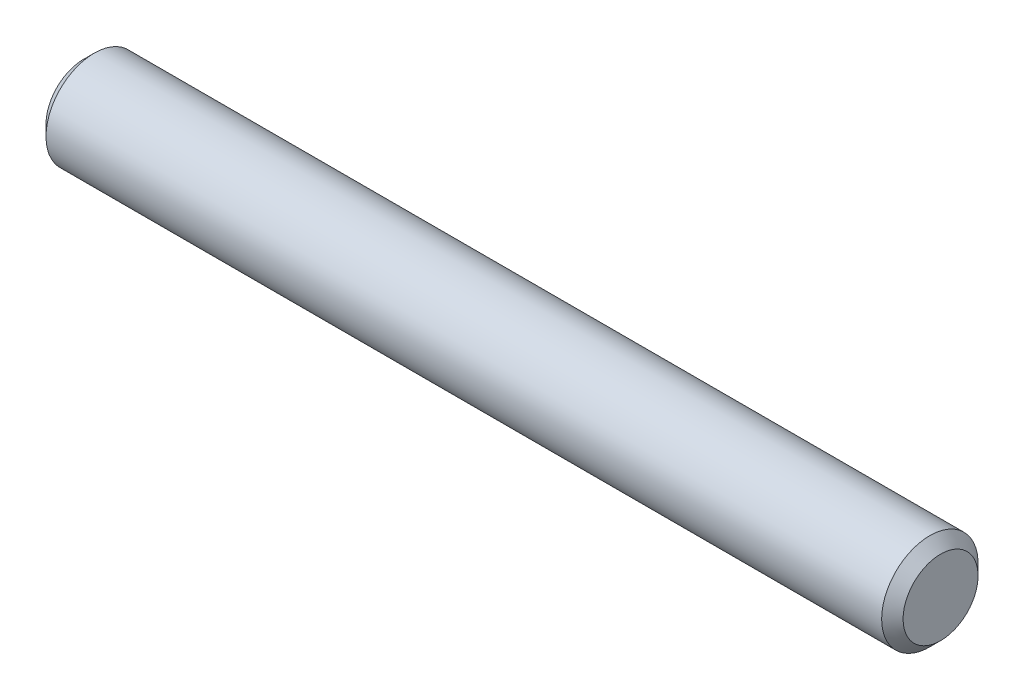
ISO-10303-21;
HEADER;
FILE_DESCRIPTION(('STEP AP214'),'2;1');
FILE_NAME('part.step','',(''),(''),'','','');
FILE_SCHEMA(('AUTOMOTIVE_DESIGN { 1 0 10303 214 1 1 1 1 }'));
ENDSEC;
DATA;
#1=APPLICATION_CONTEXT('core data for automotive mechanical design processes');
#2=APPLICATION_PROTOCOL_DEFINITION('international standard','automotive_design',2000,#1);
#3=PRODUCT_CONTEXT('',#1,'mechanical');
#4=PRODUCT('Part','Part','',(#3));
#5=PRODUCT_RELATED_PRODUCT_CATEGORY('part','',(#4));
#6=PRODUCT_DEFINITION_FORMATION('','',#4);
#7=PRODUCT_DEFINITION_CONTEXT('part definition',#1,'design');
#8=PRODUCT_DEFINITION('design','',#6,#7);
#9=PRODUCT_DEFINITION_SHAPE('','',#8);
#10=(LENGTH_UNIT() NAMED_UNIT(*) SI_UNIT(.MILLI.,.METRE.));
#11=(NAMED_UNIT(*) PLANE_ANGLE_UNIT() SI_UNIT($,.RADIAN.));
#12=(NAMED_UNIT(*) SI_UNIT($,.STERADIAN.) SOLID_ANGLE_UNIT());
#13=UNCERTAINTY_MEASURE_WITH_UNIT(LENGTH_MEASURE(1.E-05),#10,'distance_accuracy_value','');
#14=(GEOMETRIC_REPRESENTATION_CONTEXT(3) GLOBAL_UNCERTAINTY_ASSIGNED_CONTEXT((#13)) GLOBAL_UNIT_ASSIGNED_CONTEXT((#10,
#11,#12)) REPRESENTATION_CONTEXT('',''));
#15=CARTESIAN_POINT('',(0.,0.,0.));
#16=DIRECTION('',(0.,0.,1.));
#17=DIRECTION('',(1.,0.,0.));
#18=AXIS2_PLACEMENT_3D('',#15,#16,#17);
#19=CARTESIAN_POINT('',(-5.34269662921348,0.,0.));
#20=DIRECTION('',(1.,0.,0.));
#21=DIRECTION('',(0.,0.,-1.));
#22=AXIS2_PLACEMENT_3D('',#19,#20,#21);
#23=PLANE('',#22);
#24=CARTESIAN_POINT('',(-5.34269662921348,0.,0.));
#25=DIRECTION('',(1.,0.,0.));
#26=DIRECTION('',(0.,0.,-1.));
#27=AXIS2_PLACEMENT_3D('',#24,#25,#26);
#28=CIRCLE('',#27,0.699999999999999);
#29=CARTESIAN_POINT('',(-5.34269662921348,0.,-0.699999999999999));
#30=VERTEX_POINT('',#29);
#31=EDGE_CURVE('E48',#30,#30,#28,.F.);
#32=ORIENTED_EDGE('',*,*,#31,.T.);
#33=EDGE_LOOP('',(#32));
#34=FACE_BOUND('',#33,.T.);
#35=ADVANCED_FACE('F33',(#34),#23,.F.);
#36=CARTESIAN_POINT('',(-6.32022471910112,0.,0.));
#37=DIRECTION('',(-1.,0.,0.));
#38=DIRECTION('',(0.,0.,1.));
#39=AXIS2_PLACEMENT_3D('',#36,#37,#38);
#40=CYLINDRICAL_SURFACE('',#39,0.9);
#41=CARTESIAN_POINT('',(-5.14269662921348,0.,0.));
#42=DIRECTION('',(1.,0.,0.));
#43=DIRECTION('',(0.,0.,-1.));
#44=AXIS2_PLACEMENT_3D('',#41,#42,#43);
#45=CIRCLE('',#44,0.9);
#46=CARTESIAN_POINT('',(-5.14269662921348,0.,-0.9));
#47=VERTEX_POINT('',#46);
#48=EDGE_CURVE('E40',#47,#47,#45,.T.);
#49=ORIENTED_EDGE('',*,*,#48,.T.);
#50=EDGE_LOOP('',(#49));
#51=FACE_BOUND('',#50,.T.);
#52=CARTESIAN_POINT('',(10.4573033707865,0.,0.));
#53=DIRECTION('',(-1.,0.,0.));
#54=DIRECTION('',(0.,0.,1.));
#55=AXIS2_PLACEMENT_3D('',#52,#53,#54);
#56=CIRCLE('',#55,0.9);
#57=CARTESIAN_POINT('',(10.4573033707865,0.,0.9));
#58=VERTEX_POINT('',#57);
#59=EDGE_CURVE('E44',#58,#58,#56,.T.);
#60=ORIENTED_EDGE('',*,*,#59,.T.);
#61=EDGE_LOOP('',(#60));
#62=FACE_BOUND('',#61,.T.);
#63=ADVANCED_FACE('F64',(#51,#62),#40,.T.);
#64=CARTESIAN_POINT('',(10.6573033707865,0.9,0.));
#65=DIRECTION('',(-1.,0.,0.));
#66=DIRECTION('',(0.,0.,1.));
#67=AXIS2_PLACEMENT_3D('',#64,#65,#66);
#68=PLANE('',#67);
#69=CARTESIAN_POINT('',(10.6573033707865,0.,0.));
#70=DIRECTION('',(-1.,0.,0.));
#71=DIRECTION('',(0.,0.,1.));
#72=AXIS2_PLACEMENT_3D('',#69,#70,#71);
#73=CIRCLE('',#72,0.699999999999999);
#74=CARTESIAN_POINT('',(10.6573033707865,0.,0.699999999999999));
#75=VERTEX_POINT('',#74);
#76=EDGE_CURVE('E10',#75,#75,#73,.F.);
#77=ORIENTED_EDGE('',*,*,#76,.T.);
#78=EDGE_LOOP('',(#77));
#79=FACE_BOUND('',#78,.T.);
#80=ADVANCED_FACE('F57',(#79),#68,.F.);
#81=CARTESIAN_POINT('',(-5.34269662921348,0.,0.));
#82=DIRECTION('',(1.,0.,0.));
#83=DIRECTION('',(0.,0.,-1.));
#84=AXIS2_PLACEMENT_3D('',#81,#82,#83);
#85=CONICAL_SURFACE('',#84,0.699999999999999,0.785398163397449);
#86=ORIENTED_EDGE('',*,*,#48,.F.);
#87=EDGE_LOOP('',(#86));
#88=FACE_BOUND('',#87,.T.);
#89=ORIENTED_EDGE('',*,*,#31,.F.);
#90=EDGE_LOOP('',(#89));
#91=FACE_BOUND('',#90,.T.);
#92=ADVANCED_FACE('F55',(#88,#91),#85,.T.);
#93=CARTESIAN_POINT('',(10.4573033707865,0.,0.));
#94=DIRECTION('',(-1.,0.,0.));
#95=DIRECTION('',(0.,0.,1.));
#96=AXIS2_PLACEMENT_3D('',#93,#94,#95);
#97=CONICAL_SURFACE('',#96,0.9,0.785398163397445);
#98=ORIENTED_EDGE('',*,*,#76,.F.);
#99=EDGE_LOOP('',(#98));
#100=FACE_BOUND('',#99,.T.);
#101=ORIENTED_EDGE('',*,*,#59,.F.);
#102=EDGE_LOOP('',(#101));
#103=FACE_BOUND('',#102,.T.);
#104=ADVANCED_FACE('F35',(#100,#103),#97,.T.);
#105=CLOSED_SHELL('',(#35,#63,#80,#92,#104));
#106=MANIFOLD_SOLID_BREP('B2',#105);
#107=ADVANCED_BREP_SHAPE_REPRESENTATION('',(#18,#106),#14);
#108=SHAPE_DEFINITION_REPRESENTATION(#9,#107);
ENDSEC;
END-ISO-10303-21;
